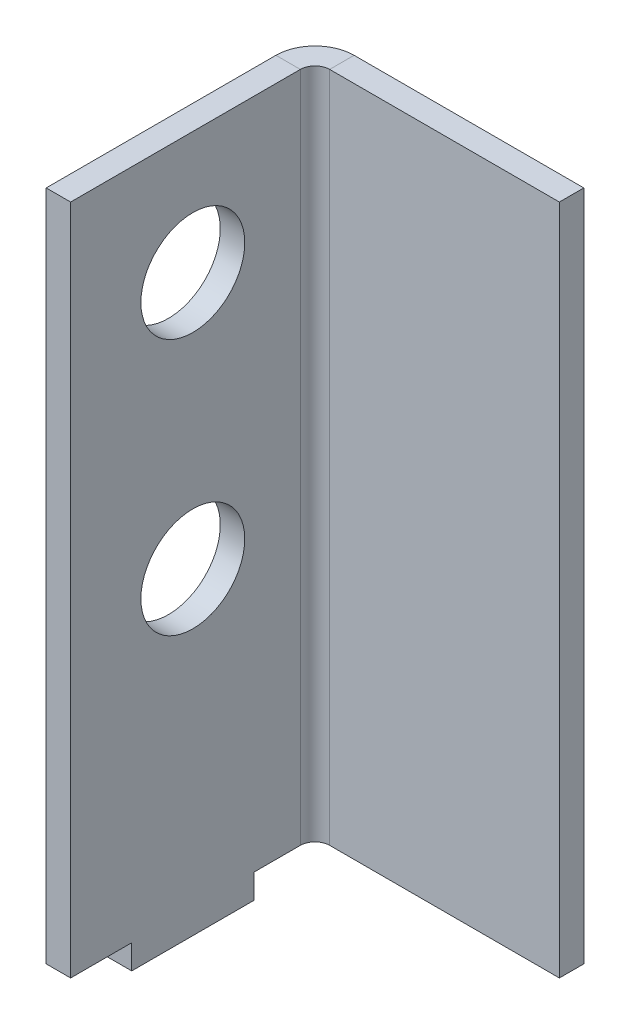
ISO-10303-21;
HEADER;
FILE_DESCRIPTION(('STEP AP214'),'2;1');
FILE_NAME('part.step','',(''),(''),'','','');
FILE_SCHEMA(('AUTOMOTIVE_DESIGN { 1 0 10303 214 1 1 1 1 }'));
ENDSEC;
DATA;
#1=APPLICATION_CONTEXT('core data for automotive mechanical design processes');
#2=APPLICATION_PROTOCOL_DEFINITION('international standard','automotive_design',2000,#1);
#3=PRODUCT_CONTEXT('',#1,'mechanical');
#4=PRODUCT('Part','Part','',(#3));
#5=PRODUCT_RELATED_PRODUCT_CATEGORY('part','',(#4));
#6=PRODUCT_DEFINITION_FORMATION('','',#4);
#7=PRODUCT_DEFINITION_CONTEXT('part definition',#1,'design');
#8=PRODUCT_DEFINITION('design','',#6,#7);
#9=PRODUCT_DEFINITION_SHAPE('','',#8);
#10=(LENGTH_UNIT() NAMED_UNIT(*) SI_UNIT(.MILLI.,.METRE.));
#11=(NAMED_UNIT(*) PLANE_ANGLE_UNIT() SI_UNIT($,.RADIAN.));
#12=(NAMED_UNIT(*) SI_UNIT($,.STERADIAN.) SOLID_ANGLE_UNIT());
#13=UNCERTAINTY_MEASURE_WITH_UNIT(LENGTH_MEASURE(1.E-05),#10,'distance_accuracy_value','');
#14=(GEOMETRIC_REPRESENTATION_CONTEXT(3) GLOBAL_UNCERTAINTY_ASSIGNED_CONTEXT((#13)) GLOBAL_UNIT_ASSIGNED_CONTEXT((#10,
#11,#12)) REPRESENTATION_CONTEXT('',''));
#15=CARTESIAN_POINT('',(0.,0.,0.));
#16=DIRECTION('',(0.,0.,1.));
#17=DIRECTION('',(1.,0.,0.));
#18=AXIS2_PLACEMENT_3D('',#15,#16,#17);
#19=CARTESIAN_POINT('',(-33.9707142128577,-2.98864894795127,20.));
#20=DIRECTION('',(0.,-1.,0.));
#21=DIRECTION('',(0.,0.,-1.));
#22=AXIS2_PLACEMENT_3D('',#19,#20,#21);
#23=PLANE('',#22);
#24=DIRECTION('',(0.,0.,-1.));
#25=VECTOR('',#24,1.);
#26=CARTESIAN_POINT('',(-33.9707142128577,-2.98864894795127,20.));
#27=LINE('',#26,#25);
#28=CARTESIAN_POINT('',(-33.9707142128577,-2.98864894795127,5.));
#29=VERTEX_POINT('',#28);
#30=CARTESIAN_POINT('',(-33.9707142128577,-2.98864894795127,1.19999999999999));
#31=VERTEX_POINT('',#30);
#32=EDGE_CURVE('E220',#29,#31,#27,.T.);
#33=ORIENTED_EDGE('',*,*,#32,.F.);
#34=DIRECTION('',(1.,0.,0.));
#35=VECTOR('',#34,1.);
#36=CARTESIAN_POINT('',(-35.9707142128577,-2.98864894795127,5.));
#37=LINE('',#36,#35);
#38=CARTESIAN_POINT('',(-35.9707142128577,-2.98864894795127,5.));
#39=VERTEX_POINT('',#38);
#40=EDGE_CURVE('E225',#39,#29,#37,.T.);
#41=ORIENTED_EDGE('',*,*,#40,.F.);
#42=DIRECTION('',(0.,0.,-1.));
#43=VECTOR('',#42,1.);
#44=CARTESIAN_POINT('',(-35.9707142128577,-2.98864894795127,20.));
#45=LINE('',#44,#43);
#46=CARTESIAN_POINT('',(-35.9707142128577,-2.98864894795127,1.19999999999999));
#47=VERTEX_POINT('',#46);
#48=EDGE_CURVE('E44',#39,#47,#45,.T.);
#49=ORIENTED_EDGE('',*,*,#48,.T.);
#50=DIRECTION('',(-1.,0.,0.));
#51=VECTOR('',#50,1.);
#52=CARTESIAN_POINT('',(-33.9707142128577,-2.98864894795127,1.19999999999999));
#53=LINE('',#52,#51);
#54=EDGE_CURVE('E202',#31,#47,#53,.T.);
#55=ORIENTED_EDGE('',*,*,#54,.F.);
#56=EDGE_LOOP('',(#33,#41,#49,#55));
#57=FACE_BOUND('',#56,.T.);
#58=ADVANCED_FACE('F35',(#57),#23,.T.);
#59=CARTESIAN_POINT('',(-35.9707142128577,-2.98864894795127,20.));
#60=VERTEX_POINT('',#59);
#61=CARTESIAN_POINT('',(-35.9707142128577,-2.98864894795127,15.));
#62=VERTEX_POINT('',#61);
#63=EDGE_CURVE('E11',#60,#62,#45,.T.);
#64=ORIENTED_EDGE('',*,*,#63,.T.);
#65=DIRECTION('',(-1.,0.,0.));
#66=VECTOR('',#65,1.);
#67=CARTESIAN_POINT('',(-35.9707142128577,-2.98864894795127,15.));
#68=LINE('',#67,#66);
#69=CARTESIAN_POINT('',(-33.9707142128577,-2.98864894795127,15.));
#70=VERTEX_POINT('',#69);
#71=EDGE_CURVE('E146',#70,#62,#68,.T.);
#72=ORIENTED_EDGE('',*,*,#71,.F.);
#73=CARTESIAN_POINT('',(-33.9707142128577,-2.98864894795127,20.));
#74=VERTEX_POINT('',#73);
#75=EDGE_CURVE('E221',#74,#70,#27,.T.);
#76=ORIENTED_EDGE('',*,*,#75,.F.);
#77=DIRECTION('',(-1.,0.,0.));
#78=VECTOR('',#77,1.);
#79=CARTESIAN_POINT('',(-33.9707142128577,-2.98864894795127,20.));
#80=LINE('',#79,#78);
#81=EDGE_CURVE('E208',#74,#60,#80,.T.);
#82=ORIENTED_EDGE('',*,*,#81,.T.);
#83=EDGE_LOOP('',(#64,#72,#76,#82));
#84=FACE_BOUND('',#83,.T.);
#85=ADVANCED_FACE('F244',(#84),#23,.T.);
#86=CARTESIAN_POINT('',(-35.9707142128577,52.0113510520487,20.));
#87=DIRECTION('',(1.,0.,0.));
#88=DIRECTION('',(0.,0.,-1.));
#89=AXIS2_PLACEMENT_3D('',#86,#87,#88);
#90=PLANE('',#89);
#91=CARTESIAN_POINT('',(-35.9707142128577,21.0113510520447,10.0000000000165));
#92=DIRECTION('',(-1.,0.,0.));
#93=DIRECTION('',(0.,0.,1.));
#94=AXIS2_PLACEMENT_3D('',#91,#92,#93);
#95=CIRCLE('',#94,4.24999999998664);
#96=CARTESIAN_POINT('',(-35.9707142128577,21.0113510520447,14.2500000000031));
#97=VERTEX_POINT('',#96);
#98=EDGE_CURVE('E235',#97,#97,#95,.T.);
#99=ORIENTED_EDGE('',*,*,#98,.F.);
#100=EDGE_LOOP('',(#99));
#101=FACE_BOUND('',#100,.T.);
#102=CARTESIAN_POINT('',(-35.9707142128577,42.0113510520438,10.0000000000239));
#103=DIRECTION('',(-1.,0.,0.));
#104=DIRECTION('',(0.,0.,1.));
#105=AXIS2_PLACEMENT_3D('',#102,#103,#104);
#106=CIRCLE('',#105,4.24999999997979);
#107=CARTESIAN_POINT('',(-35.9707142128577,42.0113510520438,14.2500000000037));
#108=VERTEX_POINT('',#107);
#109=EDGE_CURVE('E226',#108,#108,#106,.T.);
#110=ORIENTED_EDGE('',*,*,#109,.F.);
#111=EDGE_LOOP('',(#110));
#112=FACE_BOUND('',#111,.T.);
#113=DIRECTION('',(0.,1.,0.));
#114=VECTOR('',#113,1.);
#115=CARTESIAN_POINT('',(-35.9707142128577,52.0113510520487,1.19999999999999));
#116=LINE('',#115,#114);
#117=CARTESIAN_POINT('',(-35.9707142128577,52.0113510520487,1.19999999999999));
#118=VERTEX_POINT('',#117);
#119=EDGE_CURVE('E185',#118,#47,#116,.F.);
#120=ORIENTED_EDGE('',*,*,#119,.T.);
#121=ORIENTED_EDGE('',*,*,#48,.F.);
#122=DIRECTION('',(0.,1.,0.));
#123=VECTOR('',#122,1.);
#124=CARTESIAN_POINT('',(-35.9707142128577,-4.98864894795127,5.));
#125=LINE('',#124,#123);
#126=CARTESIAN_POINT('',(-35.9707142128577,-4.98864894795127,5.));
#127=VERTEX_POINT('',#126);
#128=EDGE_CURVE('E131',#127,#39,#125,.T.);
#129=ORIENTED_EDGE('',*,*,#128,.F.);
#130=DIRECTION('',(0.,0.,-1.));
#131=VECTOR('',#130,1.);
#132=CARTESIAN_POINT('',(-35.9707142128577,-4.98864894795127,15.));
#133=LINE('',#132,#131);
#134=CARTESIAN_POINT('',(-35.9707142128577,-4.98864894795127,15.));
#135=VERTEX_POINT('',#134);
#136=EDGE_CURVE('E138',#135,#127,#133,.T.);
#137=ORIENTED_EDGE('',*,*,#136,.F.);
#138=DIRECTION('',(0.,1.,0.));
#139=VECTOR('',#138,1.);
#140=CARTESIAN_POINT('',(-35.9707142128577,-4.98864894795127,15.));
#141=LINE('',#140,#139);
#142=EDGE_CURVE('E239',#135,#62,#141,.T.);
#143=ORIENTED_EDGE('',*,*,#142,.T.);
#144=ORIENTED_EDGE('',*,*,#63,.F.);
#145=DIRECTION('',(0.,1.,0.));
#146=VECTOR('',#145,1.);
#147=CARTESIAN_POINT('',(-35.9707142128577,52.0113510520487,20.));
#148=LINE('',#147,#146);
#149=CARTESIAN_POINT('',(-35.9707142128577,52.0113510520487,20.));
#150=VERTEX_POINT('',#149);
#151=EDGE_CURVE('E205',#150,#60,#148,.F.);
#152=ORIENTED_EDGE('',*,*,#151,.F.);
#153=DIRECTION('',(0.,0.,-1.));
#154=VECTOR('',#153,1.);
#155=CARTESIAN_POINT('',(-35.9707142128577,52.0113510520487,20.));
#156=LINE('',#155,#154);
#157=EDGE_CURVE('E60',#150,#118,#156,.T.);
#158=ORIENTED_EDGE('',*,*,#157,.T.);
#159=EDGE_LOOP('',(#120,#121,#129,#137,#143,#144,#152,#158));
#160=FACE_BOUND('',#159,.T.);
#161=ADVANCED_FACE('F37',(#101,#112,#160),#90,.F.);
#162=CARTESIAN_POINT('',(-33.9707142128577,52.0113510520487,20.));
#163=DIRECTION('',(1.,0.,0.));
#164=DIRECTION('',(0.,0.,-1.));
#165=AXIS2_PLACEMENT_3D('',#162,#163,#164);
#166=PLANE('',#165);
#167=CARTESIAN_POINT('',(-33.9707142128577,21.0113510520447,10.0000000000165));
#168=DIRECTION('',(1.,0.,0.));
#169=DIRECTION('',(0.,0.,-1.));
#170=AXIS2_PLACEMENT_3D('',#167,#168,#169);
#171=CIRCLE('',#170,4.24999999998664);
#172=CARTESIAN_POINT('',(-33.9707142128577,21.0113510520447,5.75000000002985));
#173=VERTEX_POINT('',#172);
#174=EDGE_CURVE('E39',#173,#173,#171,.T.);
#175=ORIENTED_EDGE('',*,*,#174,.F.);
#176=EDGE_LOOP('',(#175));
#177=FACE_BOUND('',#176,.T.);
#178=CARTESIAN_POINT('',(-33.9707142128577,42.0113510520438,10.0000000000239));
#179=DIRECTION('',(1.,0.,0.));
#180=DIRECTION('',(0.,0.,-1.));
#181=AXIS2_PLACEMENT_3D('',#178,#179,#180);
#182=CIRCLE('',#181,4.24999999997979);
#183=CARTESIAN_POINT('',(-33.9707142128577,42.0113510520438,5.75000000004414));
#184=VERTEX_POINT('',#183);
#185=EDGE_CURVE('E223',#184,#184,#182,.T.);
#186=ORIENTED_EDGE('',*,*,#185,.F.);
#187=EDGE_LOOP('',(#186));
#188=FACE_BOUND('',#187,.T.);
#189=ORIENTED_EDGE('',*,*,#75,.T.);
#190=DIRECTION('',(0.,1.,0.));
#191=VECTOR('',#190,1.);
#192=CARTESIAN_POINT('',(-33.9707142128577,-4.98864894795127,15.));
#193=LINE('',#192,#191);
#194=CARTESIAN_POINT('',(-33.9707142128577,-4.98864894795127,15.));
#195=VERTEX_POINT('',#194);
#196=EDGE_CURVE('E52',#195,#70,#193,.T.);
#197=ORIENTED_EDGE('',*,*,#196,.F.);
#198=DIRECTION('',(0.,0.,1.));
#199=VECTOR('',#198,1.);
#200=CARTESIAN_POINT('',(-33.9707142128577,-4.98864894795127,15.));
#201=LINE('',#200,#199);
#202=CARTESIAN_POINT('',(-33.9707142128577,-4.98864894795127,5.));
#203=VERTEX_POINT('',#202);
#204=EDGE_CURVE('E137',#203,#195,#201,.T.);
#205=ORIENTED_EDGE('',*,*,#204,.F.);
#206=DIRECTION('',(0.,1.,0.));
#207=VECTOR('',#206,1.);
#208=CARTESIAN_POINT('',(-33.9707142128577,-4.98864894795127,5.));
#209=LINE('',#208,#207);
#210=EDGE_CURVE('E134',#203,#29,#209,.T.);
#211=ORIENTED_EDGE('',*,*,#210,.T.);
#212=ORIENTED_EDGE('',*,*,#32,.T.);
#213=DIRECTION('',(0.,1.,0.));
#214=VECTOR('',#213,1.);
#215=CARTESIAN_POINT('',(-33.9707142128577,52.0113510520487,1.19999999999999));
#216=LINE('',#215,#214);
#217=CARTESIAN_POINT('',(-33.9707142128577,52.0113510520487,1.19999999999999));
#218=VERTEX_POINT('',#217);
#219=EDGE_CURVE('E197',#218,#31,#216,.F.);
#220=ORIENTED_EDGE('',*,*,#219,.F.);
#221=DIRECTION('',(0.,0.,-1.));
#222=VECTOR('',#221,1.);
#223=CARTESIAN_POINT('',(-33.9707142128577,52.0113510520487,20.));
#224=LINE('',#223,#222);
#225=CARTESIAN_POINT('',(-33.9707142128577,52.0113510520487,20.));
#226=VERTEX_POINT('',#225);
#227=EDGE_CURVE('E217',#226,#218,#224,.T.);
#228=ORIENTED_EDGE('',*,*,#227,.F.);
#229=DIRECTION('',(0.,-1.,0.));
#230=VECTOR('',#229,1.);
#231=CARTESIAN_POINT('',(-33.9707142128577,52.0113510520487,20.));
#232=LINE('',#231,#230);
#233=EDGE_CURVE('E211',#226,#74,#232,.T.);
#234=ORIENTED_EDGE('',*,*,#233,.T.);
#235=EDGE_LOOP('',(#189,#197,#205,#211,#212,#220,#228,#234));
#236=FACE_BOUND('',#235,.T.);
#237=ADVANCED_FACE('F251',(#177,#188,#236),#166,.T.);
#238=CARTESIAN_POINT('',(-35.9707142128577,52.0113510520487,20.));
#239=DIRECTION('',(0.,1.,0.));
#240=DIRECTION('',(0.,0.,1.));
#241=AXIS2_PLACEMENT_3D('',#238,#239,#240);
#242=PLANE('',#241);
#243=ORIENTED_EDGE('',*,*,#227,.T.);
#244=DIRECTION('',(-1.,0.,0.));
#245=VECTOR('',#244,1.);
#246=CARTESIAN_POINT('',(-33.9707142128577,52.0113510520487,1.19999999999999));
#247=LINE('',#246,#245);
#248=EDGE_CURVE('E191',#218,#118,#247,.T.);
#249=ORIENTED_EDGE('',*,*,#248,.T.);
#250=ORIENTED_EDGE('',*,*,#157,.F.);
#251=DIRECTION('',(1.,0.,0.));
#252=VECTOR('',#251,1.);
#253=CARTESIAN_POINT('',(-35.9707142128577,52.0113510520487,20.));
#254=LINE('',#253,#252);
#255=EDGE_CURVE('E214',#150,#226,#254,.T.);
#256=ORIENTED_EDGE('',*,*,#255,.T.);
#257=EDGE_LOOP('',(#243,#249,#250,#256));
#258=FACE_BOUND('',#257,.T.);
#259=ADVANCED_FACE('F253',(#258),#242,.T.);
#260=CARTESIAN_POINT('',(-35.9707142128577,-2.98864894795127,20.));
#261=DIRECTION('',(0.,0.,1.));
#262=DIRECTION('',(1.,0.,0.));
#263=AXIS2_PLACEMENT_3D('',#260,#261,#262);
#264=PLANE('',#263);
#265=ORIENTED_EDGE('',*,*,#151,.T.);
#266=ORIENTED_EDGE('',*,*,#81,.F.);
#267=ORIENTED_EDGE('',*,*,#233,.F.);
#268=ORIENTED_EDGE('',*,*,#255,.F.);
#269=EDGE_LOOP('',(#265,#266,#267,#268));
#270=FACE_BOUND('',#269,.T.);
#271=ADVANCED_FACE('F248',(#270),#264,.T.);
#272=CARTESIAN_POINT('',(-32.7707142128577,-2.98864894795127,1.19999999999999));
#273=DIRECTION('',(0.,-1.,0.));
#274=DIRECTION('',(0.,0.,-1.));
#275=AXIS2_PLACEMENT_3D('',#272,#273,#274);
#276=PLANE('',#275);
#277=DIRECTION('',(0.,0.,-1.));
#278=VECTOR('',#277,1.);
#279=CARTESIAN_POINT('',(-32.7707142128577,-2.98864894795127,0.));
#280=LINE('',#279,#278);
#281=CARTESIAN_POINT('',(-32.7707142128577,-2.98864894795127,0.));
#282=VERTEX_POINT('',#281);
#283=CARTESIAN_POINT('',(-32.7707142128577,-2.98864894795127,-2.));
#284=VERTEX_POINT('',#283);
#285=EDGE_CURVE('E150',#282,#284,#280,.T.);
#286=ORIENTED_EDGE('',*,*,#285,.F.);
#287=CARTESIAN_POINT('',(-32.7707142128577,-2.98864894795127,1.19999999999999));
#288=DIRECTION('',(0.,1.,0.));
#289=DIRECTION('',(0.,0.,1.));
#290=AXIS2_PLACEMENT_3D('',#287,#288,#289);
#291=CIRCLE('',#290,1.2);
#292=EDGE_CURVE('E194',#31,#282,#291,.F.);
#293=ORIENTED_EDGE('',*,*,#292,.F.);
#294=ORIENTED_EDGE('',*,*,#54,.T.);
#295=CARTESIAN_POINT('',(-32.7707142128577,-2.98864894795127,1.19999999999999));
#296=DIRECTION('',(0.,1.,0.));
#297=DIRECTION('',(0.,0.,1.));
#298=AXIS2_PLACEMENT_3D('',#295,#296,#297);
#299=CIRCLE('',#298,3.2);
#300=EDGE_CURVE('E187',#47,#284,#299,.F.);
#301=ORIENTED_EDGE('',*,*,#300,.T.);
#302=EDGE_LOOP('',(#286,#293,#294,#301));
#303=FACE_BOUND('',#302,.T.);
#304=ADVANCED_FACE('F286',(#303),#276,.T.);
#305=CARTESIAN_POINT('',(-32.7707142128577,52.0113510520487,1.19999999999999));
#306=DIRECTION('',(0.,-1.,0.));
#307=DIRECTION('',(0.,0.,-1.));
#308=AXIS2_PLACEMENT_3D('',#305,#306,#307);
#309=PLANE('',#308);
#310=CARTESIAN_POINT('',(-32.7707142128577,52.0113510520487,1.19999999999999));
#311=DIRECTION('',(0.,1.,0.));
#312=DIRECTION('',(0.,0.,1.));
#313=AXIS2_PLACEMENT_3D('',#310,#311,#312);
#314=CIRCLE('',#313,1.2);
#315=CARTESIAN_POINT('',(-32.7707142128577,52.0113510520487,0.));
#316=VERTEX_POINT('',#315);
#317=EDGE_CURVE('E184',#316,#218,#314,.T.);
#318=ORIENTED_EDGE('',*,*,#317,.F.);
#319=DIRECTION('',(0.,0.,-1.));
#320=VECTOR('',#319,1.);
#321=CARTESIAN_POINT('',(-32.7707142128577,52.0113510520487,0.));
#322=LINE('',#321,#320);
#323=CARTESIAN_POINT('',(-32.7707142128577,52.0113510520487,-2.));
#324=VERTEX_POINT('',#323);
#325=EDGE_CURVE('E159',#316,#324,#322,.T.);
#326=ORIENTED_EDGE('',*,*,#325,.T.);
#327=CARTESIAN_POINT('',(-32.7707142128577,52.0113510520487,1.19999999999999));
#328=DIRECTION('',(0.,1.,0.));
#329=DIRECTION('',(0.,0.,1.));
#330=AXIS2_PLACEMENT_3D('',#327,#328,#329);
#331=CIRCLE('',#330,3.2);
#332=EDGE_CURVE('E188',#324,#118,#331,.T.);
#333=ORIENTED_EDGE('',*,*,#332,.T.);
#334=ORIENTED_EDGE('',*,*,#248,.F.);
#335=EDGE_LOOP('',(#318,#326,#333,#334));
#336=FACE_BOUND('',#335,.T.);
#337=ADVANCED_FACE('F257',(#336),#309,.F.);
#338=CARTESIAN_POINT('',(-32.7707142128577,52.0113510520487,1.19999999999999));
#339=DIRECTION('',(0.,1.,0.));
#340=DIRECTION('',(0.,0.,-1.));
#341=AXIS2_PLACEMENT_3D('',#338,#339,#340);
#342=CYLINDRICAL_SURFACE('',#341,3.2);
#343=ORIENTED_EDGE('',*,*,#119,.F.);
#344=ORIENTED_EDGE('',*,*,#332,.F.);
#345=DIRECTION('',(0.,-1.,0.));
#346=VECTOR('',#345,1.);
#347=CARTESIAN_POINT('',(-32.7707142128577,52.0113510520487,-2.));
#348=LINE('',#347,#346);
#349=EDGE_CURVE('E161',#324,#284,#348,.T.);
#350=ORIENTED_EDGE('',*,*,#349,.T.);
#351=ORIENTED_EDGE('',*,*,#300,.F.);
#352=EDGE_LOOP('',(#343,#344,#350,#351));
#353=FACE_BOUND('',#352,.T.);
#354=ADVANCED_FACE('F284',(#353),#342,.T.);
#355=CARTESIAN_POINT('',(-32.7707142128577,52.0113510520487,1.19999999999999));
#356=DIRECTION('',(0.,1.,0.));
#357=DIRECTION('',(0.,0.,-1.));
#358=AXIS2_PLACEMENT_3D('',#355,#356,#357);
#359=CYLINDRICAL_SURFACE('',#358,1.2);
#360=ORIENTED_EDGE('',*,*,#219,.T.);
#361=ORIENTED_EDGE('',*,*,#292,.T.);
#362=DIRECTION('',(0.,1.,0.));
#363=VECTOR('',#362,1.);
#364=CARTESIAN_POINT('',(-32.7707142128577,-2.98864894795127,0.));
#365=LINE('',#364,#363);
#366=EDGE_CURVE('E153',#282,#316,#365,.T.);
#367=ORIENTED_EDGE('',*,*,#366,.T.);
#368=ORIENTED_EDGE('',*,*,#317,.T.);
#369=EDGE_LOOP('',(#360,#361,#367,#368));
#370=FACE_BOUND('',#369,.T.);
#371=ADVANCED_FACE('F260',(#370),#359,.F.);
#372=CARTESIAN_POINT('',(-13.9707142128577,52.0113510520487,-2.00000000000007));
#373=DIRECTION('',(0.,-1.,0.));
#374=DIRECTION('',(0.,0.,-1.));
#375=AXIS2_PLACEMENT_3D('',#372,#373,#374);
#376=PLANE('',#375);
#377=ORIENTED_EDGE('',*,*,#325,.F.);
#378=DIRECTION('',(1.,0.,0.));
#379=VECTOR('',#378,1.);
#380=CARTESIAN_POINT('',(-13.9707142128577,52.0113510520487,0.));
#381=LINE('',#380,#379);
#382=CARTESIAN_POINT('',(-13.9707142128577,52.0113510520487,0.));
#383=VERTEX_POINT('',#382);
#384=EDGE_CURVE('E164',#316,#383,#381,.T.);
#385=ORIENTED_EDGE('',*,*,#384,.T.);
#386=DIRECTION('',(0.,0.,1.));
#387=VECTOR('',#386,1.);
#388=CARTESIAN_POINT('',(-13.9707142128577,52.0113510520487,-2.00000000000007));
#389=LINE('',#388,#387);
#390=CARTESIAN_POINT('',(-13.9707142128577,52.0113510520487,-2.00000000000007));
#391=VERTEX_POINT('',#390);
#392=EDGE_CURVE('E181',#391,#383,#389,.T.);
#393=ORIENTED_EDGE('',*,*,#392,.F.);
#394=DIRECTION('',(1.,0.,0.));
#395=VECTOR('',#394,1.);
#396=CARTESIAN_POINT('',(-13.9707142128577,52.0113510520487,-2.00000000000007));
#397=LINE('',#396,#395);
#398=EDGE_CURVE('E165',#324,#391,#397,.T.);
#399=ORIENTED_EDGE('',*,*,#398,.F.);
#400=EDGE_LOOP('',(#377,#385,#393,#399));
#401=FACE_BOUND('',#400,.T.);
#402=ADVANCED_FACE('F278',(#401),#376,.F.);
#403=CARTESIAN_POINT('',(-33.9707142128577,-2.98864894795127,-2.));
#404=DIRECTION('',(0.,1.,0.));
#405=DIRECTION('',(0.,0.,1.));
#406=AXIS2_PLACEMENT_3D('',#403,#404,#405);
#407=PLANE('',#406);
#408=ORIENTED_EDGE('',*,*,#285,.T.);
#409=DIRECTION('',(-1.,0.,0.));
#410=VECTOR('',#409,1.);
#411=CARTESIAN_POINT('',(-33.9707142128577,-2.98864894795127,-2.));
#412=LINE('',#411,#410);
#413=CARTESIAN_POINT('',(-13.9707142128577,-2.98864894795127,-2.00000000000007));
#414=VERTEX_POINT('',#413);
#415=EDGE_CURVE('E170',#414,#284,#412,.T.);
#416=ORIENTED_EDGE('',*,*,#415,.F.);
#417=DIRECTION('',(0.,0.,1.));
#418=VECTOR('',#417,1.);
#419=CARTESIAN_POINT('',(-13.9707142128577,-2.98864894795127,-2.00000000000007));
#420=LINE('',#419,#418);
#421=CARTESIAN_POINT('',(-13.9707142128577,-2.98864894795127,0.));
#422=VERTEX_POINT('',#421);
#423=EDGE_CURVE('E173',#414,#422,#420,.T.);
#424=ORIENTED_EDGE('',*,*,#423,.T.);
#425=DIRECTION('',(-1.,0.,0.));
#426=VECTOR('',#425,1.);
#427=CARTESIAN_POINT('',(-33.9707142128577,-2.98864894795127,0.));
#428=LINE('',#427,#426);
#429=EDGE_CURVE('E168',#422,#282,#428,.T.);
#430=ORIENTED_EDGE('',*,*,#429,.T.);
#431=EDGE_LOOP('',(#408,#416,#424,#430));
#432=FACE_BOUND('',#431,.T.);
#433=ADVANCED_FACE('F269',(#432),#407,.F.);
#434=CARTESIAN_POINT('',(-33.9707142128577,52.0113510520487,-2.));
#435=DIRECTION('',(0.,0.,1.));
#436=DIRECTION('',(1.,0.,0.));
#437=AXIS2_PLACEMENT_3D('',#434,#435,#436);
#438=PLANE('',#437);
#439=ORIENTED_EDGE('',*,*,#349,.F.);
#440=ORIENTED_EDGE('',*,*,#398,.T.);
#441=DIRECTION('',(0.,-1.,0.));
#442=VECTOR('',#441,1.);
#443=CARTESIAN_POINT('',(-13.9707142128577,-2.98864894795127,-2.00000000000007));
#444=LINE('',#443,#442);
#445=EDGE_CURVE('E167',#391,#414,#444,.T.);
#446=ORIENTED_EDGE('',*,*,#445,.T.);
#447=ORIENTED_EDGE('',*,*,#415,.T.);
#448=EDGE_LOOP('',(#439,#440,#446,#447));
#449=FACE_BOUND('',#448,.T.);
#450=ADVANCED_FACE('F281',(#449),#438,.F.);
#451=CARTESIAN_POINT('',(-33.9707142128577,52.0113510520487,0.));
#452=DIRECTION('',(0.,0.,1.));
#453=DIRECTION('',(1.,0.,0.));
#454=AXIS2_PLACEMENT_3D('',#451,#452,#453);
#455=PLANE('',#454);
#456=ORIENTED_EDGE('',*,*,#384,.F.);
#457=ORIENTED_EDGE('',*,*,#366,.F.);
#458=ORIENTED_EDGE('',*,*,#429,.F.);
#459=DIRECTION('',(0.,-1.,0.));
#460=VECTOR('',#459,1.);
#461=CARTESIAN_POINT('',(-13.9707142128577,-2.98864894795127,0.));
#462=LINE('',#461,#460);
#463=EDGE_CURVE('E175',#383,#422,#462,.T.);
#464=ORIENTED_EDGE('',*,*,#463,.F.);
#465=EDGE_LOOP('',(#456,#457,#458,#464));
#466=FACE_BOUND('',#465,.T.);
#467=ADVANCED_FACE('F266',(#466),#455,.T.);
#468=CARTESIAN_POINT('',(-13.9707142128577,-2.98864894795127,-2.00000000000007));
#469=DIRECTION('',(-1.,0.,0.));
#470=DIRECTION('',(0.,0.,1.));
#471=AXIS2_PLACEMENT_3D('',#468,#469,#470);
#472=PLANE('',#471);
#473=ORIENTED_EDGE('',*,*,#463,.T.);
#474=ORIENTED_EDGE('',*,*,#423,.F.);
#475=ORIENTED_EDGE('',*,*,#445,.F.);
#476=ORIENTED_EDGE('',*,*,#392,.T.);
#477=EDGE_LOOP('',(#473,#474,#475,#476));
#478=FACE_BOUND('',#477,.T.);
#479=ADVANCED_FACE('F274',(#478),#472,.F.);
#480=CARTESIAN_POINT('',(-35.9707142128577,-4.98864894795127,5.));
#481=DIRECTION('',(0.,0.,1.));
#482=DIRECTION('',(1.,0.,0.));
#483=AXIS2_PLACEMENT_3D('',#480,#481,#482);
#484=PLANE('',#483);
#485=ORIENTED_EDGE('',*,*,#40,.T.);
#486=ORIENTED_EDGE('',*,*,#210,.F.);
#487=DIRECTION('',(1.,0.,0.));
#488=VECTOR('',#487,1.);
#489=CARTESIAN_POINT('',(-35.9707142128577,-4.98864894795127,5.));
#490=LINE('',#489,#488);
#491=EDGE_CURVE('E127',#127,#203,#490,.T.);
#492=ORIENTED_EDGE('',*,*,#491,.F.);
#493=ORIENTED_EDGE('',*,*,#128,.T.);
#494=EDGE_LOOP('',(#485,#486,#492,#493));
#495=FACE_BOUND('',#494,.T.);
#496=ADVANCED_FACE('F129',(#495),#484,.F.);
#497=CARTESIAN_POINT('',(-35.9707142128577,-4.98864894795127,15.));
#498=DIRECTION('',(0.,0.,-1.));
#499=DIRECTION('',(-1.,0.,0.));
#500=AXIS2_PLACEMENT_3D('',#497,#498,#499);
#501=PLANE('',#500);
#502=ORIENTED_EDGE('',*,*,#71,.T.);
#503=ORIENTED_EDGE('',*,*,#142,.F.);
#504=DIRECTION('',(-1.,0.,0.));
#505=VECTOR('',#504,1.);
#506=CARTESIAN_POINT('',(-35.9707142128577,-4.98864894795127,15.));
#507=LINE('',#506,#505);
#508=EDGE_CURVE('E142',#195,#135,#507,.T.);
#509=ORIENTED_EDGE('',*,*,#508,.F.);
#510=ORIENTED_EDGE('',*,*,#196,.T.);
#511=EDGE_LOOP('',(#502,#503,#509,#510));
#512=FACE_BOUND('',#511,.T.);
#513=ADVANCED_FACE('F290',(#512),#501,.F.);
#514=CARTESIAN_POINT('',(-35.9707142128577,-4.98864894795127,5.));
#515=DIRECTION('',(0.,-1.,0.));
#516=DIRECTION('',(0.,0.,-1.));
#517=AXIS2_PLACEMENT_3D('',#514,#515,#516);
#518=PLANE('',#517);
#519=ORIENTED_EDGE('',*,*,#136,.T.);
#520=ORIENTED_EDGE('',*,*,#491,.T.);
#521=ORIENTED_EDGE('',*,*,#204,.T.);
#522=ORIENTED_EDGE('',*,*,#508,.T.);
#523=EDGE_LOOP('',(#519,#520,#521,#522));
#524=FACE_BOUND('',#523,.T.);
#525=ADVANCED_FACE('F141',(#524),#518,.T.);
#526=CARTESIAN_POINT('',(-30.9707142128577,42.0113510520438,10.0000000000239));
#527=DIRECTION('',(-1.,0.,0.));
#528=DIRECTION('',(0.,0.,1.));
#529=AXIS2_PLACEMENT_3D('',#526,#527,#528);
#530=CYLINDRICAL_SURFACE('',#529,4.24999999997979);
#531=ORIENTED_EDGE('',*,*,#185,.T.);
#532=EDGE_LOOP('',(#531));
#533=FACE_BOUND('',#532,.T.);
#534=ORIENTED_EDGE('',*,*,#109,.T.);
#535=EDGE_LOOP('',(#534));
#536=FACE_BOUND('',#535,.T.);
#537=ADVANCED_FACE('F297',(#533,#536),#530,.F.);
#538=CARTESIAN_POINT('',(-30.9707142128577,21.0113510520447,10.0000000000165));
#539=DIRECTION('',(-1.,0.,0.));
#540=DIRECTION('',(0.,0.,1.));
#541=AXIS2_PLACEMENT_3D('',#538,#539,#540);
#542=CYLINDRICAL_SURFACE('',#541,4.24999999998664);
#543=ORIENTED_EDGE('',*,*,#174,.T.);
#544=EDGE_LOOP('',(#543));
#545=FACE_BOUND('',#544,.T.);
#546=ORIENTED_EDGE('',*,*,#98,.T.);
#547=EDGE_LOOP('',(#546));
#548=FACE_BOUND('',#547,.T.);
#549=ADVANCED_FACE('F384',(#545,#548),#542,.F.);
#550=CLOSED_SHELL('',(#58,#85,#161,#237,#259,#271,#304,#337,#354,#371,#402,#433,#450,#467,#479,
#496,#513,#525,#537,#549));
#551=MANIFOLD_SOLID_BREP('B2',#550);
#552=ADVANCED_BREP_SHAPE_REPRESENTATION('',(#18,#551),#14);
#553=SHAPE_DEFINITION_REPRESENTATION(#9,#552);
ENDSEC;
END-ISO-10303-21;
